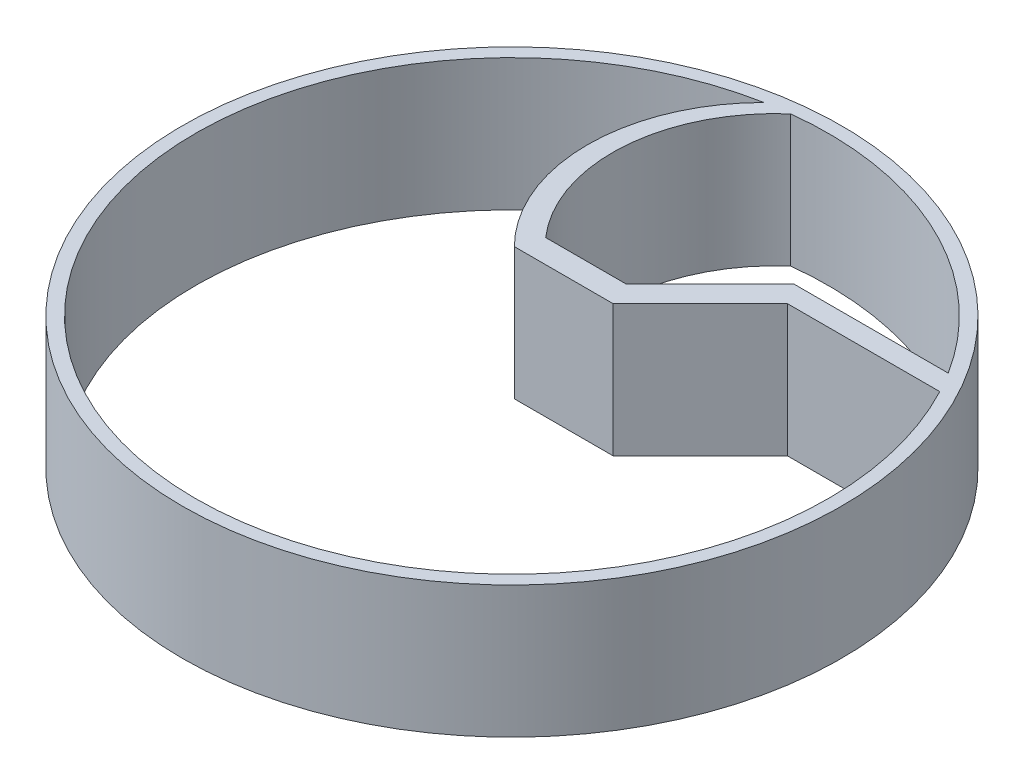
ISO-10303-21;
HEADER;
FILE_DESCRIPTION(('STEP AP214'),'2;1');
FILE_NAME('part.step','',(''),(''),'','','');
FILE_SCHEMA(('AUTOMOTIVE_DESIGN { 1 0 10303 214 1 1 1 1 }'));
ENDSEC;
DATA;
#1=APPLICATION_CONTEXT('core data for automotive mechanical design processes');
#2=APPLICATION_PROTOCOL_DEFINITION('international standard','automotive_design',2000,#1);
#3=PRODUCT_CONTEXT('',#1,'mechanical');
#4=PRODUCT('Part','Part','',(#3));
#5=PRODUCT_RELATED_PRODUCT_CATEGORY('part','',(#4));
#6=PRODUCT_DEFINITION_FORMATION('','',#4);
#7=PRODUCT_DEFINITION_CONTEXT('part definition',#1,'design');
#8=PRODUCT_DEFINITION('design','',#6,#7);
#9=PRODUCT_DEFINITION_SHAPE('','',#8);
#10=(LENGTH_UNIT() NAMED_UNIT(*) SI_UNIT(.MILLI.,.METRE.));
#11=(NAMED_UNIT(*) PLANE_ANGLE_UNIT() SI_UNIT($,.RADIAN.));
#12=(NAMED_UNIT(*) SI_UNIT($,.STERADIAN.) SOLID_ANGLE_UNIT());
#13=UNCERTAINTY_MEASURE_WITH_UNIT(LENGTH_MEASURE(1.E-05),#10,'distance_accuracy_value','');
#14=(GEOMETRIC_REPRESENTATION_CONTEXT(3) GLOBAL_UNCERTAINTY_ASSIGNED_CONTEXT((#13)) GLOBAL_UNIT_ASSIGNED_CONTEXT((#10,
#11,#12)) REPRESENTATION_CONTEXT('',''));
#15=CARTESIAN_POINT('',(0.,0.,0.));
#16=DIRECTION('',(0.,0.,1.));
#17=DIRECTION('',(1.,0.,0.));
#18=AXIS2_PLACEMENT_3D('',#15,#16,#17);
#19=CARTESIAN_POINT('',(0.,1.,0.));
#20=DIRECTION('',(0.,-1.,0.));
#21=DIRECTION('',(0.,0.,-1.));
#22=AXIS2_PLACEMENT_3D('',#19,#20,#21);
#23=CYLINDRICAL_SURFACE('',#22,2.4);
#24=CARTESIAN_POINT('',(0.,0.,0.));
#25=DIRECTION('',(0.,1.,0.));
#26=DIRECTION('',(0.,0.,1.));
#27=AXIS2_PLACEMENT_3D('',#24,#25,#26);
#28=CIRCLE('',#27,2.4);
#29=CARTESIAN_POINT('',(2.03073857741742,0.,-1.27910157149019));
#30=VERTEX_POINT('',#29);
#31=CARTESIAN_POINT('',(-0.270096360026155,0.,-2.384753227548));
#32=VERTEX_POINT('',#31);
#33=EDGE_CURVE('E133',#30,#32,#28,.T.);
#34=ORIENTED_EDGE('',*,*,#33,.F.);
#35=DIRECTION('',(0.,-1.,0.));
#36=VECTOR('',#35,1.);
#37=CARTESIAN_POINT('',(2.03073857741742,1.,-1.27910157149019));
#38=LINE('',#37,#36);
#39=CARTESIAN_POINT('',(2.03073857741742,1.,-1.27910157149019));
#40=VERTEX_POINT('',#39);
#41=EDGE_CURVE('E63',#40,#30,#38,.T.);
#42=ORIENTED_EDGE('',*,*,#41,.F.);
#43=CARTESIAN_POINT('',(0.,1.,0.));
#44=DIRECTION('',(0.,1.,0.));
#45=DIRECTION('',(0.,0.,1.));
#46=AXIS2_PLACEMENT_3D('',#43,#44,#45);
#47=CIRCLE('',#46,2.4);
#48=CARTESIAN_POINT('',(-0.270096360026155,1.,-2.384753227548));
#49=VERTEX_POINT('',#48);
#50=EDGE_CURVE('E131',#40,#49,#47,.T.);
#51=ORIENTED_EDGE('',*,*,#50,.T.);
#52=DIRECTION('',(0.,-1.,0.));
#53=VECTOR('',#52,1.);
#54=CARTESIAN_POINT('',(-0.270096360026155,1.,-2.384753227548));
#55=LINE('',#54,#53);
#56=EDGE_CURVE('E206',#49,#32,#55,.T.);
#57=ORIENTED_EDGE('',*,*,#56,.T.);
#58=EDGE_LOOP('',(#34,#42,#51,#57));
#59=FACE_BOUND('',#58,.T.);
#60=ADVANCED_FACE('F39',(#59),#23,.F.);
#61=CARTESIAN_POINT('',(-0.446002172620877,0.,-2.35819466160397));
#62=VERTEX_POINT('',#61);
#63=CARTESIAN_POINT('',(2.11964816225855,0.,-1.12565166380811));
#64=VERTEX_POINT('',#63);
#65=EDGE_CURVE('E135',#62,#64,#28,.T.);
#66=ORIENTED_EDGE('',*,*,#65,.F.);
#67=DIRECTION('',(0.,-1.,0.));
#68=VECTOR('',#67,1.);
#69=CARTESIAN_POINT('',(-0.446002172620878,1.,-2.35819466160397));
#70=LINE('',#69,#68);
#71=CARTESIAN_POINT('',(-0.446002172620878,1.,-2.35819466160397));
#72=VERTEX_POINT('',#71);
#73=EDGE_CURVE('E203',#72,#62,#70,.T.);
#74=ORIENTED_EDGE('',*,*,#73,.F.);
#75=CARTESIAN_POINT('',(2.11964816225855,1.,-1.12565166380811));
#76=VERTEX_POINT('',#75);
#77=EDGE_CURVE('E143',#72,#76,#47,.T.);
#78=ORIENTED_EDGE('',*,*,#77,.T.);
#79=DIRECTION('',(0.,-1.,0.));
#80=VECTOR('',#79,1.);
#81=CARTESIAN_POINT('',(2.11964816225855,1.,-1.12565166380811));
#82=LINE('',#81,#80);
#83=EDGE_CURVE('E187',#76,#64,#82,.T.);
#84=ORIENTED_EDGE('',*,*,#83,.T.);
#85=EDGE_LOOP('',(#66,#74,#78,#84));
#86=FACE_BOUND('',#85,.T.);
#87=ADVANCED_FACE('F247',(#86),#23,.F.);
#88=CARTESIAN_POINT('',(0.,1.,0.));
#89=DIRECTION('',(0.,1.,0.));
#90=DIRECTION('',(0.,0.,1.));
#91=AXIS2_PLACEMENT_3D('',#88,#89,#90);
#92=PLANE('',#91);
#93=ORIENTED_EDGE('',*,*,#50,.F.);
#94=DIRECTION('',(-1.,0.,0.));
#95=VECTOR('',#94,1.);
#96=CARTESIAN_POINT('',(2.03073857741742,1.,-1.27910157149019));
#97=LINE('',#96,#95);
#98=CARTESIAN_POINT('',(0.859210067843162,1.,-1.27910157149019));
#99=VERTEX_POINT('',#98);
#100=EDGE_CURVE('E116',#40,#99,#97,.T.);
#101=ORIENTED_EDGE('',*,*,#100,.T.);
#102=DIRECTION('',(-0.707106781186546,0.,0.707106781186549));
#103=VECTOR('',#102,1.);
#104=CARTESIAN_POINT('',(0.859210067843162,1.,-1.27910157149019));
#105=LINE('',#104,#103);
#106=CARTESIAN_POINT('',(0.222938709837925,1.,-0.642830213484951));
#107=VERTEX_POINT('',#106);
#108=EDGE_CURVE('E124',#99,#107,#105,.T.);
#109=ORIENTED_EDGE('',*,*,#108,.T.);
#110=DIRECTION('',(-1.,0.,0.));
#111=VECTOR('',#110,1.);
#112=CARTESIAN_POINT('',(0.222938709837925,1.,-0.642830213484951));
#113=LINE('',#112,#111);
#114=CARTESIAN_POINT('',(-0.386972473303408,1.,-0.642830213484951));
#115=VERTEX_POINT('',#114);
#116=EDGE_CURVE('E222',#107,#115,#113,.T.);
#117=ORIENTED_EDGE('',*,*,#116,.T.);
#118=CARTESIAN_POINT('',(0.542427090366754,1.,-1.45535366387785));
#119=DIRECTION('',(0.,-1.,0.));
#120=DIRECTION('',(0.,0.,-1.));
#121=AXIS2_PLACEMENT_3D('',#118,#119,#120);
#122=CIRCLE('',#121,1.23449500055232);
#123=EDGE_CURVE('E140',#115,#49,#122,.T.);
#124=ORIENTED_EDGE('',*,*,#123,.T.);
#125=EDGE_LOOP('',(#93,#101,#109,#117,#124));
#126=FACE_BOUND('',#125,.T.);
#127=CARTESIAN_POINT('',(0.,1.,0.));
#128=DIRECTION('',(0.,1.,0.));
#129=DIRECTION('',(0.,0.,1.));
#130=AXIS2_PLACEMENT_3D('',#127,#128,#129);
#131=CIRCLE('',#130,2.5);
#132=CARTESIAN_POINT('',(0.,1.,2.5));
#133=VERTEX_POINT('',#132);
#134=EDGE_CURVE('E11',#133,#133,#131,.T.);
#135=ORIENTED_EDGE('',*,*,#134,.T.);
#136=EDGE_LOOP('',(#135));
#137=FACE_BOUND('',#136,.T.);
#138=DIRECTION('',(1.,0.,0.));
#139=VECTOR('',#138,1.);
#140=CARTESIAN_POINT('',(2.11964816225855,1.,-1.12565166380811));
#141=LINE('',#140,#139);
#142=CARTESIAN_POINT('',(0.964151755518662,1.,-1.12565166380811));
#143=VERTEX_POINT('',#142);
#144=EDGE_CURVE('E170',#143,#76,#141,.T.);
#145=ORIENTED_EDGE('',*,*,#144,.T.);
#146=ORIENTED_EDGE('',*,*,#77,.F.);
#147=CARTESIAN_POINT('',(0.500873658326974,1.,-1.41131883065612));
#148=DIRECTION('',(0.,1.,0.));
#149=DIRECTION('',(0.,0.,-1.));
#150=AXIS2_PLACEMENT_3D('',#147,#148,#149);
#151=CIRCLE('',#150,1.33908464200974);
#152=CARTESIAN_POINT('',(-0.446002172620878,1.,-0.464442999708269));
#153=VERTEX_POINT('',#152);
#154=EDGE_CURVE('E229',#72,#153,#151,.T.);
#155=ORIENTED_EDGE('',*,*,#154,.T.);
#156=DIRECTION('',(1.,0.,0.));
#157=VECTOR('',#156,1.);
#158=CARTESIAN_POINT('',(0.302943091418826,1.,-0.464442999708269));
#159=LINE('',#158,#157);
#160=CARTESIAN_POINT('',(0.302943091418826,1.,-0.464442999708269));
#161=VERTEX_POINT('',#160);
#162=EDGE_CURVE('E232',#153,#161,#159,.T.);
#163=ORIENTED_EDGE('',*,*,#162,.T.);
#164=DIRECTION('',(0.707106781186546,0.,-0.707106781186549));
#165=VECTOR('',#164,1.);
#166=CARTESIAN_POINT('',(0.964151755518662,1.,-1.12565166380811));
#167=LINE('',#166,#165);
#168=EDGE_CURVE('E234',#161,#143,#167,.T.);
#169=ORIENTED_EDGE('',*,*,#168,.T.);
#170=EDGE_LOOP('',(#145,#146,#155,#163,#169));
#171=FACE_BOUND('',#170,.T.);
#172=ADVANCED_FACE('F137',(#126,#137,#171),#92,.T.);
#173=CARTESIAN_POINT('',(0.,0.,0.));
#174=DIRECTION('',(0.,1.,0.));
#175=DIRECTION('',(0.,0.,1.));
#176=AXIS2_PLACEMENT_3D('',#173,#174,#175);
#177=PLANE('',#176);
#178=DIRECTION('',(-1.,0.,0.));
#179=VECTOR('',#178,1.);
#180=CARTESIAN_POINT('',(2.03073857741742,0.,-1.27910157149019));
#181=LINE('',#180,#179);
#182=CARTESIAN_POINT('',(0.859210067843162,0.,-1.27910157149019));
#183=VERTEX_POINT('',#182);
#184=EDGE_CURVE('E162',#30,#183,#181,.T.);
#185=ORIENTED_EDGE('',*,*,#184,.F.);
#186=ORIENTED_EDGE('',*,*,#33,.T.);
#187=CARTESIAN_POINT('',(0.542427090366754,0.,-1.45535366387785));
#188=DIRECTION('',(0.,-1.,0.));
#189=DIRECTION('',(0.,0.,-1.));
#190=AXIS2_PLACEMENT_3D('',#187,#188,#189);
#191=CIRCLE('',#190,1.23449500055232);
#192=CARTESIAN_POINT('',(-0.386972473303408,0.,-0.642830213484951));
#193=VERTEX_POINT('',#192);
#194=EDGE_CURVE('E160',#193,#32,#191,.T.);
#195=ORIENTED_EDGE('',*,*,#194,.F.);
#196=DIRECTION('',(-1.,0.,0.));
#197=VECTOR('',#196,1.);
#198=CARTESIAN_POINT('',(0.222938709837925,0.,-0.642830213484951));
#199=LINE('',#198,#197);
#200=CARTESIAN_POINT('',(0.222938709837925,0.,-0.642830213484951));
#201=VERTEX_POINT('',#200);
#202=EDGE_CURVE('E167',#201,#193,#199,.T.);
#203=ORIENTED_EDGE('',*,*,#202,.F.);
#204=DIRECTION('',(-0.707106781186546,0.,0.707106781186549));
#205=VECTOR('',#204,1.);
#206=CARTESIAN_POINT('',(0.859210067843162,0.,-1.27910157149019));
#207=LINE('',#206,#205);
#208=EDGE_CURVE('E163',#183,#201,#207,.T.);
#209=ORIENTED_EDGE('',*,*,#208,.F.);
#210=EDGE_LOOP('',(#185,#186,#195,#203,#209));
#211=FACE_BOUND('',#210,.T.);
#212=CARTESIAN_POINT('',(0.,0.,0.));
#213=DIRECTION('',(0.,1.,0.));
#214=DIRECTION('',(0.,0.,1.));
#215=AXIS2_PLACEMENT_3D('',#212,#213,#214);
#216=CIRCLE('',#215,2.5);
#217=CARTESIAN_POINT('',(0.,0.,2.5));
#218=VERTEX_POINT('',#217);
#219=EDGE_CURVE('E43',#218,#218,#216,.T.);
#220=ORIENTED_EDGE('',*,*,#219,.F.);
#221=EDGE_LOOP('',(#220));
#222=FACE_BOUND('',#221,.T.);
#223=ORIENTED_EDGE('',*,*,#65,.T.);
#224=DIRECTION('',(1.,0.,0.));
#225=VECTOR('',#224,1.);
#226=CARTESIAN_POINT('',(2.11964816225855,0.,-1.12565166380811));
#227=LINE('',#226,#225);
#228=CARTESIAN_POINT('',(0.964151755518662,0.,-1.12565166380811));
#229=VERTEX_POINT('',#228);
#230=EDGE_CURVE('E125',#229,#64,#227,.T.);
#231=ORIENTED_EDGE('',*,*,#230,.F.);
#232=DIRECTION('',(0.707106781186546,0.,-0.707106781186549));
#233=VECTOR('',#232,1.);
#234=CARTESIAN_POINT('',(0.964151755518662,0.,-1.12565166380811));
#235=LINE('',#234,#233);
#236=CARTESIAN_POINT('',(0.302943091418826,0.,-0.464442999708269));
#237=VERTEX_POINT('',#236);
#238=EDGE_CURVE('E182',#237,#229,#235,.T.);
#239=ORIENTED_EDGE('',*,*,#238,.F.);
#240=DIRECTION('',(1.,0.,0.));
#241=VECTOR('',#240,1.);
#242=CARTESIAN_POINT('',(0.302943091418826,0.,-0.464442999708269));
#243=LINE('',#242,#241);
#244=CARTESIAN_POINT('',(-0.446002172620878,0.,-0.464442999708269));
#245=VERTEX_POINT('',#244);
#246=EDGE_CURVE('E179',#245,#237,#243,.T.);
#247=ORIENTED_EDGE('',*,*,#246,.F.);
#248=CARTESIAN_POINT('',(0.500873658326974,0.,-1.41131883065612));
#249=DIRECTION('',(0.,1.,0.));
#250=DIRECTION('',(0.,0.,-1.));
#251=AXIS2_PLACEMENT_3D('',#248,#249,#250);
#252=CIRCLE('',#251,1.33908464200974);
#253=EDGE_CURVE('E55',#62,#245,#252,.T.);
#254=ORIENTED_EDGE('',*,*,#253,.F.);
#255=EDGE_LOOP('',(#223,#231,#239,#247,#254));
#256=FACE_BOUND('',#255,.T.);
#257=ADVANCED_FACE('F157',(#211,#222,#256),#177,.F.);
#258=CARTESIAN_POINT('',(0.,1.,0.));
#259=DIRECTION('',(0.,-1.,0.));
#260=DIRECTION('',(0.,0.,-1.));
#261=AXIS2_PLACEMENT_3D('',#258,#259,#260);
#262=CYLINDRICAL_SURFACE('',#261,2.5);
#263=ORIENTED_EDGE('',*,*,#134,.F.);
#264=EDGE_LOOP('',(#263));
#265=FACE_BOUND('',#264,.T.);
#266=ORIENTED_EDGE('',*,*,#219,.T.);
#267=EDGE_LOOP('',(#266));
#268=FACE_BOUND('',#267,.T.);
#269=ADVANCED_FACE('F41',(#265,#268),#262,.T.);
#270=CARTESIAN_POINT('',(2.03073857741742,1.,-1.27910157149019));
#271=DIRECTION('',(0.,0.,1.));
#272=DIRECTION('',(1.,0.,0.));
#273=AXIS2_PLACEMENT_3D('',#270,#271,#272);
#274=PLANE('',#273);
#275=ORIENTED_EDGE('',*,*,#184,.T.);
#276=DIRECTION('',(0.,-1.,0.));
#277=VECTOR('',#276,1.);
#278=CARTESIAN_POINT('',(0.859210067843162,1.,-1.27910157149019));
#279=LINE('',#278,#277);
#280=EDGE_CURVE('E119',#99,#183,#279,.T.);
#281=ORIENTED_EDGE('',*,*,#280,.F.);
#282=ORIENTED_EDGE('',*,*,#100,.F.);
#283=ORIENTED_EDGE('',*,*,#41,.T.);
#284=EDGE_LOOP('',(#275,#281,#282,#283));
#285=FACE_BOUND('',#284,.T.);
#286=ADVANCED_FACE('F117',(#285),#274,.F.);
#287=CARTESIAN_POINT('',(0.859210067843162,1.,-1.27910157149019));
#288=DIRECTION('',(0.707106781186549,0.,0.707106781186546));
#289=DIRECTION('',(0.707106781186546,0.,-0.707106781186549));
#290=AXIS2_PLACEMENT_3D('',#287,#288,#289);
#291=PLANE('',#290);
#292=ORIENTED_EDGE('',*,*,#208,.T.);
#293=DIRECTION('',(0.,-1.,0.));
#294=VECTOR('',#293,1.);
#295=CARTESIAN_POINT('',(0.222938709837925,1.,-0.642830213484951));
#296=LINE('',#295,#294);
#297=EDGE_CURVE('E213',#107,#201,#296,.T.);
#298=ORIENTED_EDGE('',*,*,#297,.F.);
#299=ORIENTED_EDGE('',*,*,#108,.F.);
#300=ORIENTED_EDGE('',*,*,#280,.T.);
#301=EDGE_LOOP('',(#292,#298,#299,#300));
#302=FACE_BOUND('',#301,.T.);
#303=ADVANCED_FACE('F218',(#302),#291,.F.);
#304=CARTESIAN_POINT('',(0.222938709837925,1.,-0.642830213484951));
#305=DIRECTION('',(0.,0.,1.));
#306=DIRECTION('',(1.,0.,0.));
#307=AXIS2_PLACEMENT_3D('',#304,#305,#306);
#308=PLANE('',#307);
#309=ORIENTED_EDGE('',*,*,#202,.T.);
#310=DIRECTION('',(0.,-1.,0.));
#311=VECTOR('',#310,1.);
#312=CARTESIAN_POINT('',(-0.386972473303408,1.,-0.642830213484951));
#313=LINE('',#312,#311);
#314=EDGE_CURVE('E209',#115,#193,#313,.T.);
#315=ORIENTED_EDGE('',*,*,#314,.F.);
#316=ORIENTED_EDGE('',*,*,#116,.F.);
#317=ORIENTED_EDGE('',*,*,#297,.T.);
#318=EDGE_LOOP('',(#309,#315,#316,#317));
#319=FACE_BOUND('',#318,.T.);
#320=ADVANCED_FACE('F275',(#319),#308,.F.);
#321=CARTESIAN_POINT('',(0.542427090366754,1.,-1.45535366387785));
#322=DIRECTION('',(0.,-1.,0.));
#323=DIRECTION('',(0.,0.,-1.));
#324=AXIS2_PLACEMENT_3D('',#321,#322,#323);
#325=CYLINDRICAL_SURFACE('',#324,1.23449500055232);
#326=ORIENTED_EDGE('',*,*,#194,.T.);
#327=ORIENTED_EDGE('',*,*,#56,.F.);
#328=ORIENTED_EDGE('',*,*,#123,.F.);
#329=ORIENTED_EDGE('',*,*,#314,.T.);
#330=EDGE_LOOP('',(#326,#327,#328,#329));
#331=FACE_BOUND('',#330,.T.);
#332=ADVANCED_FACE('F278',(#331),#325,.F.);
#333=CARTESIAN_POINT('',(0.500873658326974,1.,-1.41131883065612));
#334=DIRECTION('',(0.,-1.,0.));
#335=DIRECTION('',(0.,0.,-1.));
#336=AXIS2_PLACEMENT_3D('',#333,#334,#335);
#337=CYLINDRICAL_SURFACE('',#336,1.33908464200974);
#338=ORIENTED_EDGE('',*,*,#253,.T.);
#339=DIRECTION('',(0.,-1.,0.));
#340=VECTOR('',#339,1.);
#341=CARTESIAN_POINT('',(-0.446002172620878,1.,-0.464442999708269));
#342=LINE('',#341,#340);
#343=EDGE_CURVE('E199',#153,#245,#342,.T.);
#344=ORIENTED_EDGE('',*,*,#343,.F.);
#345=ORIENTED_EDGE('',*,*,#154,.F.);
#346=ORIENTED_EDGE('',*,*,#73,.T.);
#347=EDGE_LOOP('',(#338,#344,#345,#346));
#348=FACE_BOUND('',#347,.T.);
#349=ADVANCED_FACE('F249',(#348),#337,.T.);
#350=CARTESIAN_POINT('',(0.302943091418826,1.,-0.464442999708269));
#351=DIRECTION('',(0.,0.,-1.));
#352=DIRECTION('',(-1.,0.,0.));
#353=AXIS2_PLACEMENT_3D('',#350,#351,#352);
#354=PLANE('',#353);
#355=ORIENTED_EDGE('',*,*,#246,.T.);
#356=DIRECTION('',(0.,-1.,0.));
#357=VECTOR('',#356,1.);
#358=CARTESIAN_POINT('',(0.302943091418826,1.,-0.464442999708269));
#359=LINE('',#358,#357);
#360=EDGE_CURVE('E195',#161,#237,#359,.T.);
#361=ORIENTED_EDGE('',*,*,#360,.F.);
#362=ORIENTED_EDGE('',*,*,#162,.F.);
#363=ORIENTED_EDGE('',*,*,#343,.T.);
#364=EDGE_LOOP('',(#355,#361,#362,#363));
#365=FACE_BOUND('',#364,.T.);
#366=ADVANCED_FACE('F254',(#365),#354,.F.);
#367=CARTESIAN_POINT('',(0.964151755518662,1.,-1.12565166380811));
#368=DIRECTION('',(-0.707106781186549,0.,-0.707106781186546));
#369=DIRECTION('',(-0.707106781186546,0.,0.707106781186549));
#370=AXIS2_PLACEMENT_3D('',#367,#368,#369);
#371=PLANE('',#370);
#372=ORIENTED_EDGE('',*,*,#238,.T.);
#373=DIRECTION('',(0.,-1.,0.));
#374=VECTOR('',#373,1.);
#375=CARTESIAN_POINT('',(0.964151755518662,1.,-1.12565166380811));
#376=LINE('',#375,#374);
#377=EDGE_CURVE('E191',#143,#229,#376,.T.);
#378=ORIENTED_EDGE('',*,*,#377,.F.);
#379=ORIENTED_EDGE('',*,*,#168,.F.);
#380=ORIENTED_EDGE('',*,*,#360,.T.);
#381=EDGE_LOOP('',(#372,#378,#379,#380));
#382=FACE_BOUND('',#381,.T.);
#383=ADVANCED_FACE('F257',(#382),#371,.F.);
#384=CARTESIAN_POINT('',(2.11964816225855,1.,-1.12565166380811));
#385=DIRECTION('',(0.,0.,-1.));
#386=DIRECTION('',(-1.,0.,0.));
#387=AXIS2_PLACEMENT_3D('',#384,#385,#386);
#388=PLANE('',#387);
#389=ORIENTED_EDGE('',*,*,#230,.T.);
#390=ORIENTED_EDGE('',*,*,#83,.F.);
#391=ORIENTED_EDGE('',*,*,#144,.F.);
#392=ORIENTED_EDGE('',*,*,#377,.T.);
#393=EDGE_LOOP('',(#389,#390,#391,#392));
#394=FACE_BOUND('',#393,.T.);
#395=ADVANCED_FACE('F244',(#394),#388,.F.);
#396=CLOSED_SHELL('',(#60,#87,#172,#257,#269,#286,#303,#320,#332,#349,#366,#383,#395));
#397=MANIFOLD_SOLID_BREP('B2',#396);
#398=ADVANCED_BREP_SHAPE_REPRESENTATION('',(#18,#397),#14);
#399=SHAPE_DEFINITION_REPRESENTATION(#9,#398);
ENDSEC;
END-ISO-10303-21;
